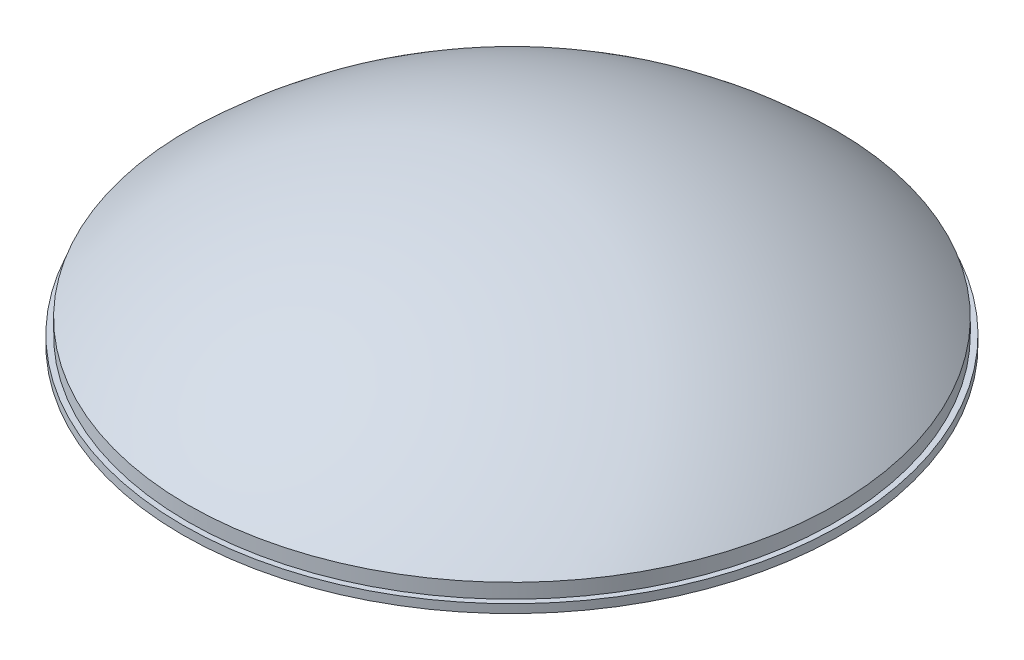
ISO-10303-21;
HEADER;
FILE_DESCRIPTION(('STEP AP214'),'2;1');
FILE_NAME('part.step','',(''),(''),'','','');
FILE_SCHEMA(('AUTOMOTIVE_DESIGN { 1 0 10303 214 1 1 1 1 }'));
ENDSEC;
DATA;
#1=APPLICATION_CONTEXT('core data for automotive mechanical design processes');
#2=APPLICATION_PROTOCOL_DEFINITION('international standard','automotive_design',2000,#1);
#3=PRODUCT_CONTEXT('',#1,'mechanical');
#4=PRODUCT('Part','Part','',(#3));
#5=PRODUCT_RELATED_PRODUCT_CATEGORY('part','',(#4));
#6=PRODUCT_DEFINITION_FORMATION('','',#4);
#7=PRODUCT_DEFINITION_CONTEXT('part definition',#1,'design');
#8=PRODUCT_DEFINITION('design','',#6,#7);
#9=PRODUCT_DEFINITION_SHAPE('','',#8);
#10=(LENGTH_UNIT() NAMED_UNIT(*) SI_UNIT(.MILLI.,.METRE.));
#11=(NAMED_UNIT(*) PLANE_ANGLE_UNIT() SI_UNIT($,.RADIAN.));
#12=(NAMED_UNIT(*) SI_UNIT($,.STERADIAN.) SOLID_ANGLE_UNIT());
#13=UNCERTAINTY_MEASURE_WITH_UNIT(LENGTH_MEASURE(1.E-05),#10,'distance_accuracy_value','');
#14=(GEOMETRIC_REPRESENTATION_CONTEXT(3) GLOBAL_UNCERTAINTY_ASSIGNED_CONTEXT((#13)) GLOBAL_UNIT_ASSIGNED_CONTEXT((#10,
#11,#12)) REPRESENTATION_CONTEXT('',''));
#15=CARTESIAN_POINT('',(0.,0.,0.));
#16=DIRECTION('',(0.,0.,1.));
#17=DIRECTION('',(1.,0.,0.));
#18=AXIS2_PLACEMENT_3D('',#15,#16,#17);
#19=CARTESIAN_POINT('',(0.,0.,0.));
#20=DIRECTION('',(0.,1.,0.));
#21=DIRECTION('',(0.,0.,-1.));
#22=AXIS2_PLACEMENT_3D('',#19,#20,#21);
#23=SPHERICAL_SURFACE('',#22,347.);
#24=CARTESIAN_POINT('',(0.,252.045134846916,0.));
#25=DIRECTION('',(0.,1.,0.));
#26=DIRECTION('',(0.,0.,1.));
#27=AXIS2_PLACEMENT_3D('',#24,#25,#26);
#28=CIRCLE('',#27,238.5);
#29=CARTESIAN_POINT('',(0.,252.045134846916,238.5));
#30=VERTEX_POINT('',#29);
#31=EDGE_CURVE('E53',#30,#30,#28,.T.);
#32=ORIENTED_EDGE('',*,*,#31,.T.);
#33=EDGE_LOOP('',(#32));
#34=FACE_BOUND('',#33,.T.);
#35=ADVANCED_FACE('F34',(#34),#23,.T.);
#36=CARTESIAN_POINT('',(0.,0.,0.));
#37=DIRECTION('',(0.,1.,0.));
#38=DIRECTION('',(0.,0.,-1.));
#39=AXIS2_PLACEMENT_3D('',#36,#37,#38);
#40=SPHERICAL_SURFACE('',#39,332.);
#41=CARTESIAN_POINT('',(0.,234.956089799648,0.));
#42=DIRECTION('',(0.,1.,0.));
#43=DIRECTION('',(0.,0.,1.));
#44=AXIS2_PLACEMENT_3D('',#41,#42,#43);
#45=CIRCLE('',#44,234.562648062431);
#46=CARTESIAN_POINT('',(0.,234.956089799648,234.562648062431));
#47=VERTEX_POINT('',#46);
#48=EDGE_CURVE('E10',#47,#47,#45,.T.);
#49=ORIENTED_EDGE('',*,*,#48,.F.);
#50=EDGE_LOOP('',(#49));
#51=FACE_BOUND('',#50,.T.);
#52=ADVANCED_FACE('F77',(#51),#40,.F.);
#53=CARTESIAN_POINT('',(0.,234.956089799648,-242.5));
#54=DIRECTION('',(0.,1.,0.));
#55=DIRECTION('',(0.,0.,1.));
#56=AXIS2_PLACEMENT_3D('',#53,#54,#55);
#57=PLANE('',#56);
#58=CARTESIAN_POINT('',(0.,234.956089799648,0.));
#59=DIRECTION('',(0.,1.,0.));
#60=DIRECTION('',(0.,0.,1.));
#61=AXIS2_PLACEMENT_3D('',#58,#59,#60);
#62=CIRCLE('',#61,242.5);
#63=CARTESIAN_POINT('',(0.,234.956089799648,242.5));
#64=VERTEX_POINT('',#63);
#65=EDGE_CURVE('E40',#64,#64,#62,.T.);
#66=ORIENTED_EDGE('',*,*,#65,.F.);
#67=EDGE_LOOP('',(#66));
#68=FACE_BOUND('',#67,.T.);
#69=ORIENTED_EDGE('',*,*,#48,.T.);
#70=EDGE_LOOP('',(#69));
#71=FACE_BOUND('',#70,.T.);
#72=ADVANCED_FACE('F72',(#68,#71),#57,.F.);
#73=CARTESIAN_POINT('',(0.,347.,0.));
#74=DIRECTION('',(0.,1.,0.));
#75=DIRECTION('',(0.,0.,1.));
#76=AXIS2_PLACEMENT_3D('',#73,#74,#75);
#77=CYLINDRICAL_SURFACE('',#76,242.5);
#78=CARTESIAN_POINT('',(0.,241.256089799648,0.));
#79=DIRECTION('',(0.,1.,0.));
#80=DIRECTION('',(0.,0.,1.));
#81=AXIS2_PLACEMENT_3D('',#78,#79,#80);
#82=CIRCLE('',#81,242.5);
#83=CARTESIAN_POINT('',(0.,241.256089799648,242.5));
#84=VERTEX_POINT('',#83);
#85=EDGE_CURVE('E44',#84,#84,#82,.T.);
#86=ORIENTED_EDGE('',*,*,#85,.F.);
#87=EDGE_LOOP('',(#86));
#88=FACE_BOUND('',#87,.T.);
#89=ORIENTED_EDGE('',*,*,#65,.T.);
#90=EDGE_LOOP('',(#89));
#91=FACE_BOUND('',#90,.T.);
#92=ADVANCED_FACE('F67',(#88,#91),#77,.T.);
#93=CARTESIAN_POINT('',(0.,241.256089799648,-242.5));
#94=DIRECTION('',(0.,-1.,0.));
#95=DIRECTION('',(0.,0.,-1.));
#96=AXIS2_PLACEMENT_3D('',#93,#94,#95);
#97=PLANE('',#96);
#98=CARTESIAN_POINT('',(0.,241.256089799648,0.));
#99=DIRECTION('',(0.,1.,0.));
#100=DIRECTION('',(0.,0.,1.));
#101=AXIS2_PLACEMENT_3D('',#98,#99,#100);
#102=CIRCLE('',#101,238.5);
#103=CARTESIAN_POINT('',(0.,241.256089799648,238.5));
#104=VERTEX_POINT('',#103);
#105=EDGE_CURVE('E48',#104,#104,#102,.T.);
#106=ORIENTED_EDGE('',*,*,#105,.F.);
#107=EDGE_LOOP('',(#106));
#108=FACE_BOUND('',#107,.T.);
#109=ORIENTED_EDGE('',*,*,#85,.T.);
#110=EDGE_LOOP('',(#109));
#111=FACE_BOUND('',#110,.T.);
#112=ADVANCED_FACE('F61',(#108,#111),#97,.F.);
#113=CARTESIAN_POINT('',(0.,347.,0.));
#114=DIRECTION('',(0.,1.,0.));
#115=DIRECTION('',(0.,0.,1.));
#116=AXIS2_PLACEMENT_3D('',#113,#114,#115);
#117=CYLINDRICAL_SURFACE('',#116,238.5);
#118=ORIENTED_EDGE('',*,*,#31,.F.);
#119=EDGE_LOOP('',(#118));
#120=FACE_BOUND('',#119,.T.);
#121=ORIENTED_EDGE('',*,*,#105,.T.);
#122=EDGE_LOOP('',(#121));
#123=FACE_BOUND('',#122,.T.);
#124=ADVANCED_FACE('F58',(#120,#123),#117,.T.);
#125=CLOSED_SHELL('',(#35,#52,#72,#92,#112,#124));
#126=MANIFOLD_SOLID_BREP('B2',#125);
#127=ADVANCED_BREP_SHAPE_REPRESENTATION('',(#18,#126),#14);
#128=SHAPE_DEFINITION_REPRESENTATION(#9,#127);
ENDSEC;
END-ISO-10303-21;
